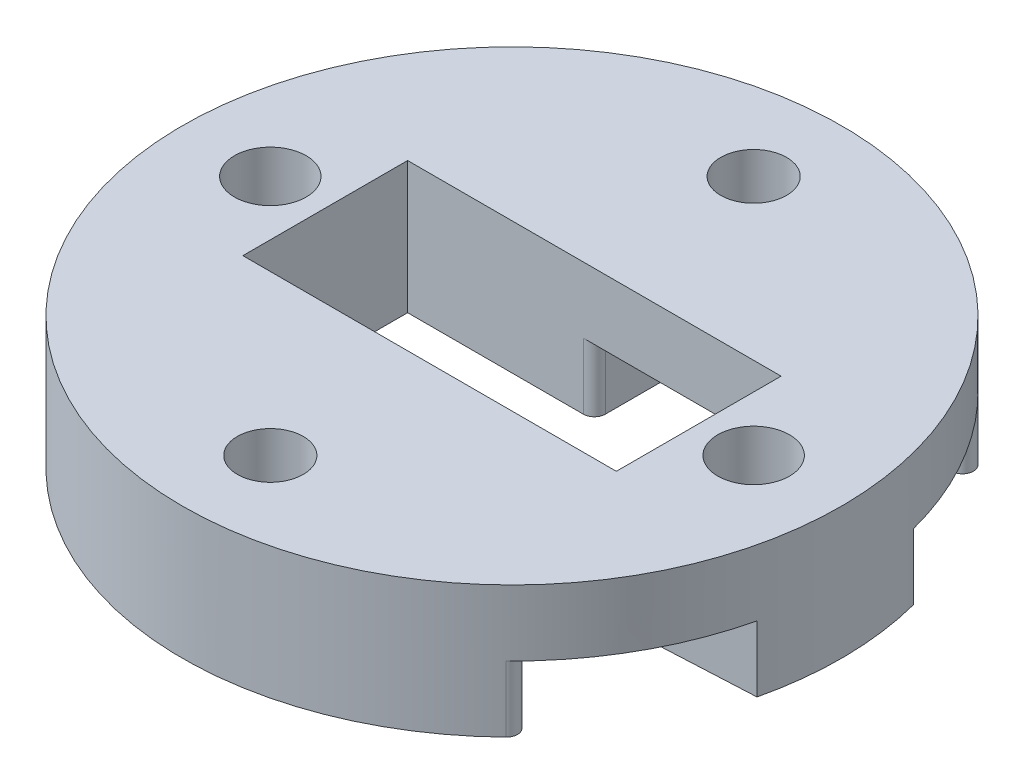
ISO-10303-21;
HEADER;
FILE_DESCRIPTION(('STEP AP214'),'2;1');
FILE_NAME('part.step','',(''),(''),'','','');
FILE_SCHEMA(('AUTOMOTIVE_DESIGN { 1 0 10303 214 1 1 1 1 }'));
ENDSEC;
DATA;
#1=APPLICATION_CONTEXT('core data for automotive mechanical design processes');
#2=APPLICATION_PROTOCOL_DEFINITION('international standard','automotive_design',2000,#1);
#3=PRODUCT_CONTEXT('',#1,'mechanical');
#4=PRODUCT('Part','Part','',(#3));
#5=PRODUCT_RELATED_PRODUCT_CATEGORY('part','',(#4));
#6=PRODUCT_DEFINITION_FORMATION('','',#4);
#7=PRODUCT_DEFINITION_CONTEXT('part definition',#1,'design');
#8=PRODUCT_DEFINITION('design','',#6,#7);
#9=PRODUCT_DEFINITION_SHAPE('','',#8);
#10=(LENGTH_UNIT() NAMED_UNIT(*) SI_UNIT(.MILLI.,.METRE.));
#11=(NAMED_UNIT(*) PLANE_ANGLE_UNIT() SI_UNIT($,.RADIAN.));
#12=(NAMED_UNIT(*) SI_UNIT($,.STERADIAN.) SOLID_ANGLE_UNIT());
#13=UNCERTAINTY_MEASURE_WITH_UNIT(LENGTH_MEASURE(1.E-05),#10,'distance_accuracy_value','');
#14=(GEOMETRIC_REPRESENTATION_CONTEXT(3) GLOBAL_UNCERTAINTY_ASSIGNED_CONTEXT((#13)) GLOBAL_UNIT_ASSIGNED_CONTEXT((#10,
#11,#12)) REPRESENTATION_CONTEXT('',''));
#15=CARTESIAN_POINT('',(0.,0.,0.));
#16=DIRECTION('',(0.,0.,1.));
#17=DIRECTION('',(1.,0.,0.));
#18=AXIS2_PLACEMENT_3D('',#15,#16,#17);
#19=CARTESIAN_POINT('',(0.,0.,0.));
#20=DIRECTION('',(0.,1.,0.));
#21=DIRECTION('',(0.,0.,1.));
#22=AXIS2_PLACEMENT_3D('',#19,#20,#21);
#23=PLANE('',#22);
#24=DIRECTION('',(1.,0.,0.));
#25=VECTOR('',#24,1.);
#26=CARTESIAN_POINT('',(0.,0.,-7.5));
#27=LINE('',#26,#25);
#28=CARTESIAN_POINT('',(17.,0.,-7.49999999999999));
#29=VERTEX_POINT('',#28);
#30=CARTESIAN_POINT('',(29.0473750965556,0.,-7.49999999999999));
#31=VERTEX_POINT('',#30);
#32=EDGE_CURVE('E427',#29,#31,#27,.T.);
#33=ORIENTED_EDGE('',*,*,#32,.F.);
#34=DIRECTION('',(-1.,0.,0.));
#35=VECTOR('',#34,1.);
#36=CARTESIAN_POINT('',(-17.,0.,-7.49999999999999));
#37=LINE('',#36,#35);
#38=CARTESIAN_POINT('',(-1.00000000000001,0.,-7.49999999999999));
#39=VERTEX_POINT('',#38);
#40=EDGE_CURVE('E379',#29,#39,#37,.T.);
#41=ORIENTED_EDGE('',*,*,#40,.T.);
#42=CARTESIAN_POINT('',(-1.,0.,-8.49999999999999));
#43=DIRECTION('',(0.,-1.,0.));
#44=DIRECTION('',(0.,0.,-1.));
#45=AXIS2_PLACEMENT_3D('',#42,#43,#44);
#46=CIRCLE('',#45,1.);
#47=CARTESIAN_POINT('',(0.,0.,-8.5));
#48=VERTEX_POINT('',#47);
#49=EDGE_CURVE('E269',#39,#48,#46,.F.);
#50=ORIENTED_EDGE('',*,*,#49,.T.);
#51=DIRECTION('',(0.,0.,1.));
#52=VECTOR('',#51,1.);
#53=CARTESIAN_POINT('',(0.,0.,0.));
#54=LINE('',#53,#52);
#55=CARTESIAN_POINT('',(0.,0.,-18.7566976916097));
#56=VERTEX_POINT('',#55);
#57=EDGE_CURVE('E282',#56,#48,#54,.T.);
#58=ORIENTED_EDGE('',*,*,#57,.F.);
#59=CARTESIAN_POINT('',(1.,0.,-18.7566976916097));
#60=DIRECTION('',(0.,-1.,0.));
#61=DIRECTION('',(0.,0.,-1.));
#62=AXIS2_PLACEMENT_3D('',#59,#60,#61);
#63=CIRCLE('',#62,1.);
#64=CARTESIAN_POINT('',(0.0300873514827654,0.,-19.0001508785806));
#65=VERTEX_POINT('',#64);
#66=EDGE_CURVE('E340',#56,#65,#63,.T.);
#67=ORIENTED_EDGE('',*,*,#66,.T.);
#68=CARTESIAN_POINT('',(0.,0.,-22.));
#69=DIRECTION('',(0.,1.,0.));
#70=DIRECTION('',(0.,0.,1.));
#71=AXIS2_PLACEMENT_3D('',#68,#69,#70);
#72=CIRCLE('',#71,3.);
#73=CARTESIAN_POINT('',(1.99188221367901,0.,-19.7566976916097));
#74=VERTEX_POINT('',#73);
#75=EDGE_CURVE('E400',#65,#74,#72,.T.);
#76=ORIENTED_EDGE('',*,*,#75,.T.);
#77=DIRECTION('',(-1.,0.,0.));
#78=VECTOR('',#77,1.);
#79=CARTESIAN_POINT('',(0.,0.,-19.7566976916097));
#80=LINE('',#79,#78);
#81=CARTESIAN_POINT('',(20.2523949432931,0.,-19.7566976916097));
#82=VERTEX_POINT('',#81);
#83=EDGE_CURVE('E338',#82,#74,#80,.T.);
#84=ORIENTED_EDGE('',*,*,#83,.F.);
#85=CARTESIAN_POINT('',(20.2523949432931,0.,-20.7566976916097));
#86=DIRECTION('',(0.,-1.,0.));
#87=DIRECTION('',(0.,0.,-1.));
#88=AXIS2_PLACEMENT_3D('',#85,#86,#87);
#89=CIRCLE('',#88,1.);
#90=CARTESIAN_POINT('',(20.9507533896136,0.,-21.4724458878721));
#91=VERTEX_POINT('',#90);
#92=EDGE_CURVE('E336',#91,#82,#89,.T.);
#93=ORIENTED_EDGE('',*,*,#92,.F.);
#94=CARTESIAN_POINT('',(0.,0.,0.));
#95=DIRECTION('',(0.,1.,0.));
#96=DIRECTION('',(0.,0.,1.));
#97=AXIS2_PLACEMENT_3D('',#94,#95,#96);
#98=CIRCLE('',#97,30.);
#99=EDGE_CURVE('E114',#31,#91,#98,.T.);
#100=ORIENTED_EDGE('',*,*,#99,.F.);
#101=EDGE_LOOP('',(#33,#41,#50,#58,#67,#76,#84,#93,#100));
#102=FACE_BOUND('',#101,.T.);
#103=ADVANCED_FACE('F99',(#102),#23,.F.);
#104=DIRECTION('',(-0.998754741045197,0.,0.0498895504062889));
#105=VECTOR('',#104,1.);
#106=CARTESIAN_POINT('',(0.416018130552311,0.,8.32839897064905));
#107=LINE('',#106,#105);
#108=CARTESIAN_POINT('',(29.1979169572441,0.,6.8906926616905));
#109=VERTEX_POINT('',#108);
#110=CARTESIAN_POINT('',(17.,0.,7.50000000000001));
#111=VERTEX_POINT('',#110);
#112=EDGE_CURVE('E122',#109,#111,#107,.T.);
#113=ORIENTED_EDGE('',*,*,#112,.F.);
#114=CARTESIAN_POINT('',(20.9507533896136,0.,21.4724458878721));
#115=VERTEX_POINT('',#114);
#116=EDGE_CURVE('E103',#115,#109,#98,.T.);
#117=ORIENTED_EDGE('',*,*,#116,.F.);
#118=CARTESIAN_POINT('',(20.2523949432931,0.,20.7566976916097));
#119=DIRECTION('',(0.,-1.,0.));
#120=DIRECTION('',(0.,0.,-1.));
#121=AXIS2_PLACEMENT_3D('',#118,#119,#120);
#122=CIRCLE('',#121,1.);
#123=CARTESIAN_POINT('',(20.2523949432931,0.,19.7566976916097));
#124=VERTEX_POINT('',#123);
#125=EDGE_CURVE('E333',#115,#124,#122,.F.);
#126=ORIENTED_EDGE('',*,*,#125,.T.);
#127=DIRECTION('',(1.,0.,0.));
#128=VECTOR('',#127,1.);
#129=CARTESIAN_POINT('',(0.,0.,19.7566976916097));
#130=LINE('',#129,#128);
#131=CARTESIAN_POINT('',(1.991882213679,0.,19.7566976916097));
#132=VERTEX_POINT('',#131);
#133=EDGE_CURVE('E330',#132,#124,#130,.T.);
#134=ORIENTED_EDGE('',*,*,#133,.F.);
#135=CARTESIAN_POINT('',(0.,0.,22.));
#136=DIRECTION('',(0.,1.,0.));
#137=DIRECTION('',(0.,0.,1.));
#138=AXIS2_PLACEMENT_3D('',#135,#136,#137);
#139=CIRCLE('',#138,3.);
#140=CARTESIAN_POINT('',(0.0300873514827662,0.,19.0001508785806));
#141=VERTEX_POINT('',#140);
#142=EDGE_CURVE('E396',#132,#141,#139,.T.);
#143=ORIENTED_EDGE('',*,*,#142,.T.);
#144=CARTESIAN_POINT('',(1.,0.,18.7566976916097));
#145=DIRECTION('',(0.,-1.,0.));
#146=DIRECTION('',(0.,0.,-1.));
#147=AXIS2_PLACEMENT_3D('',#144,#145,#146);
#148=CIRCLE('',#147,1.);
#149=CARTESIAN_POINT('',(0.,0.,18.7566976916097));
#150=VERTEX_POINT('',#149);
#151=EDGE_CURVE('E327',#141,#150,#148,.T.);
#152=ORIENTED_EDGE('',*,*,#151,.T.);
#153=DIRECTION('',(0.,0.,1.));
#154=VECTOR('',#153,1.);
#155=CARTESIAN_POINT('',(0.,0.,0.));
#156=LINE('',#155,#154);
#157=CARTESIAN_POINT('',(0.,0.,8.50000000000002));
#158=VERTEX_POINT('',#157);
#159=EDGE_CURVE('E324',#158,#150,#156,.T.);
#160=ORIENTED_EDGE('',*,*,#159,.F.);
#161=CARTESIAN_POINT('',(-1.,0.,8.50000000000001));
#162=DIRECTION('',(0.,-1.,0.));
#163=DIRECTION('',(0.,0.,-1.));
#164=AXIS2_PLACEMENT_3D('',#161,#162,#163);
#165=CIRCLE('',#164,1.);
#166=CARTESIAN_POINT('',(-1.,0.,7.50000000000001));
#167=VERTEX_POINT('',#166);
#168=EDGE_CURVE('E272',#158,#167,#165,.F.);
#169=ORIENTED_EDGE('',*,*,#168,.T.);
#170=DIRECTION('',(1.,0.,0.));
#171=VECTOR('',#170,1.);
#172=CARTESIAN_POINT('',(-17.,0.,7.50000000000001));
#173=LINE('',#172,#171);
#174=EDGE_CURVE('E375',#167,#111,#173,.T.);
#175=ORIENTED_EDGE('',*,*,#174,.T.);
#176=EDGE_LOOP('',(#113,#117,#126,#134,#143,#152,#160,#169,#175));
#177=FACE_BOUND('',#176,.T.);
#178=ADVANCED_FACE('F450',(#177),#23,.F.);
#179=CARTESIAN_POINT('',(0.,6.,0.));
#180=DIRECTION('',(0.,1.,0.));
#181=DIRECTION('',(0.,0.,1.));
#182=AXIS2_PLACEMENT_3D('',#179,#180,#181);
#183=PLANE('',#182);
#184=CARTESIAN_POINT('',(0.,6.,-22.));
#185=DIRECTION('',(0.,1.,0.));
#186=DIRECTION('',(0.,0.,1.));
#187=AXIS2_PLACEMENT_3D('',#184,#185,#186);
#188=CIRCLE('',#187,3.);
#189=CARTESIAN_POINT('',(0.,6.,-19.));
#190=VERTEX_POINT('',#189);
#191=EDGE_CURVE('E403',#190,#190,#188,.T.);
#192=ORIENTED_EDGE('',*,*,#191,.F.);
#193=EDGE_LOOP('',(#192));
#194=FACE_BOUND('',#193,.T.);
#195=CARTESIAN_POINT('',(-22.,6.,0.));
#196=DIRECTION('',(0.,1.,0.));
#197=DIRECTION('',(0.,0.,1.));
#198=AXIS2_PLACEMENT_3D('',#195,#196,#197);
#199=CIRCLE('',#198,3.26527405947026);
#200=CARTESIAN_POINT('',(-22.,6.,3.26527405947027));
#201=VERTEX_POINT('',#200);
#202=EDGE_CURVE('E411',#201,#201,#199,.T.);
#203=ORIENTED_EDGE('',*,*,#202,.F.);
#204=EDGE_LOOP('',(#203));
#205=FACE_BOUND('',#204,.T.);
#206=CARTESIAN_POINT('',(0.,6.,0.));
#207=DIRECTION('',(0.,1.,0.));
#208=DIRECTION('',(0.,0.,1.));
#209=AXIS2_PLACEMENT_3D('',#206,#207,#208);
#210=CIRCLE('',#209,30.);
#211=CARTESIAN_POINT('',(0.,6.,30.));
#212=VERTEX_POINT('',#211);
#213=EDGE_CURVE('E12',#212,#212,#210,.T.);
#214=ORIENTED_EDGE('',*,*,#213,.T.);
#215=EDGE_LOOP('',(#214));
#216=FACE_BOUND('',#215,.T.);
#217=CARTESIAN_POINT('',(22.,6.,0.));
#218=DIRECTION('',(0.,1.,0.));
#219=DIRECTION('',(0.,0.,1.));
#220=AXIS2_PLACEMENT_3D('',#217,#218,#219);
#221=CIRCLE('',#220,3.26527405947026);
#222=CARTESIAN_POINT('',(22.,6.,3.26527405947026));
#223=VERTEX_POINT('',#222);
#224=EDGE_CURVE('E406',#223,#223,#221,.T.);
#225=ORIENTED_EDGE('',*,*,#224,.F.);
#226=EDGE_LOOP('',(#225));
#227=FACE_BOUND('',#226,.T.);
#228=CARTESIAN_POINT('',(0.,6.,22.));
#229=DIRECTION('',(0.,1.,0.));
#230=DIRECTION('',(0.,0.,1.));
#231=AXIS2_PLACEMENT_3D('',#228,#229,#230);
#232=CIRCLE('',#231,3.);
#233=CARTESIAN_POINT('',(0.,6.,25.));
#234=VERTEX_POINT('',#233);
#235=EDGE_CURVE('E397',#234,#234,#232,.T.);
#236=ORIENTED_EDGE('',*,*,#235,.F.);
#237=EDGE_LOOP('',(#236));
#238=FACE_BOUND('',#237,.T.);
#239=DIRECTION('',(1.,0.,0.));
#240=VECTOR('',#239,1.);
#241=CARTESIAN_POINT('',(-17.,6.,7.50000000000001));
#242=LINE('',#241,#240);
#243=CARTESIAN_POINT('',(-17.,6.,7.50000000000001));
#244=VERTEX_POINT('',#243);
#245=CARTESIAN_POINT('',(17.,6.,7.50000000000001));
#246=VERTEX_POINT('',#245);
#247=EDGE_CURVE('E378',#244,#246,#242,.T.);
#248=ORIENTED_EDGE('',*,*,#247,.F.);
#249=DIRECTION('',(0.,0.,1.));
#250=VECTOR('',#249,1.);
#251=CARTESIAN_POINT('',(-17.,6.,-7.49999999999999));
#252=LINE('',#251,#250);
#253=CARTESIAN_POINT('',(-17.,6.,-7.49999999999999));
#254=VERTEX_POINT('',#253);
#255=EDGE_CURVE('E376',#254,#244,#252,.T.);
#256=ORIENTED_EDGE('',*,*,#255,.F.);
#257=DIRECTION('',(-1.,0.,0.));
#258=VECTOR('',#257,1.);
#259=CARTESIAN_POINT('',(-17.,6.,-7.49999999999999));
#260=LINE('',#259,#258);
#261=CARTESIAN_POINT('',(17.,6.,-7.49999999999999));
#262=VERTEX_POINT('',#261);
#263=EDGE_CURVE('E383',#262,#254,#260,.T.);
#264=ORIENTED_EDGE('',*,*,#263,.F.);
#265=DIRECTION('',(0.,0.,-1.));
#266=VECTOR('',#265,1.);
#267=CARTESIAN_POINT('',(17.,6.,-7.49999999999999));
#268=LINE('',#267,#266);
#269=EDGE_CURVE('E381',#246,#262,#268,.T.);
#270=ORIENTED_EDGE('',*,*,#269,.F.);
#271=EDGE_LOOP('',(#248,#256,#264,#270));
#272=FACE_BOUND('',#271,.T.);
#273=ADVANCED_FACE('F454',(#194,#205,#216,#227,#238,#272),#183,.T.);
#274=CARTESIAN_POINT('',(0.,6.,0.));
#275=DIRECTION('',(0.,-1.,0.));
#276=DIRECTION('',(0.,0.,-1.));
#277=AXIS2_PLACEMENT_3D('',#274,#275,#276);
#278=CYLINDRICAL_SURFACE('',#277,30.);
#279=ORIENTED_EDGE('',*,*,#213,.F.);
#280=EDGE_LOOP('',(#279));
#281=FACE_BOUND('',#280,.T.);
#282=ORIENTED_EDGE('',*,*,#116,.T.);
#283=DIRECTION('',(0.,1.,0.));
#284=VECTOR('',#283,1.);
#285=CARTESIAN_POINT('',(29.1979169572441,-6.,6.8906926616905));
#286=LINE('',#285,#284);
#287=CARTESIAN_POINT('',(29.1979169572441,-6.,6.8906926616905));
#288=VERTEX_POINT('',#287);
#289=EDGE_CURVE('E274',#288,#109,#286,.T.);
#290=ORIENTED_EDGE('',*,*,#289,.F.);
#291=CARTESIAN_POINT('',(0.,-6.,0.));
#292=DIRECTION('',(0.,-1.,0.));
#293=DIRECTION('',(0.,0.,-1.));
#294=AXIS2_PLACEMENT_3D('',#291,#292,#293);
#295=CIRCLE('',#294,30.);
#296=CARTESIAN_POINT('',(29.0473750965556,-6.,-7.49999999999999));
#297=VERTEX_POINT('',#296);
#298=EDGE_CURVE('E253',#297,#288,#295,.T.);
#299=ORIENTED_EDGE('',*,*,#298,.F.);
#300=DIRECTION('',(0.,1.,0.));
#301=VECTOR('',#300,1.);
#302=CARTESIAN_POINT('',(29.0473750965556,-6.,-7.49999999999999));
#303=LINE('',#302,#301);
#304=EDGE_CURVE('E250',#297,#31,#303,.T.);
#305=ORIENTED_EDGE('',*,*,#304,.T.);
#306=ORIENTED_EDGE('',*,*,#99,.T.);
#307=DIRECTION('',(0.,1.,0.));
#308=VECTOR('',#307,1.);
#309=CARTESIAN_POINT('',(20.9507533896136,-6.,-21.4724458878721));
#310=LINE('',#309,#308);
#311=CARTESIAN_POINT('',(20.9507533896136,-6.,-21.4724458878721));
#312=VERTEX_POINT('',#311);
#313=EDGE_CURVE('E356',#312,#91,#310,.T.);
#314=ORIENTED_EDGE('',*,*,#313,.F.);
#315=CARTESIAN_POINT('',(0.,-6.,0.));
#316=DIRECTION('',(0.,-1.,0.));
#317=DIRECTION('',(0.,0.,-1.));
#318=AXIS2_PLACEMENT_3D('',#315,#316,#317);
#319=CIRCLE('',#318,30.);
#320=CARTESIAN_POINT('',(20.9507533896136,-6.,21.4724458878721));
#321=VERTEX_POINT('',#320);
#322=EDGE_CURVE('E305',#321,#312,#319,.T.);
#323=ORIENTED_EDGE('',*,*,#322,.F.);
#324=DIRECTION('',(0.,1.,0.));
#325=VECTOR('',#324,1.);
#326=CARTESIAN_POINT('',(20.9507533896136,-6.,21.4724458878721));
#327=LINE('',#326,#325);
#328=EDGE_CURVE('E359',#321,#115,#327,.T.);
#329=ORIENTED_EDGE('',*,*,#328,.T.);
#330=EDGE_LOOP('',(#282,#290,#299,#305,#306,#314,#323,#329));
#331=FACE_BOUND('',#330,.T.);
#332=ADVANCED_FACE('F101',(#281,#331),#278,.T.);
#333=CARTESIAN_POINT('',(-22.,6.,0.));
#334=DIRECTION('',(0.,-1.,0.));
#335=DIRECTION('',(0.,0.,-1.));
#336=AXIS2_PLACEMENT_3D('',#333,#334,#335);
#337=CYLINDRICAL_SURFACE('',#336,3.26527405947026);
#338=ORIENTED_EDGE('',*,*,#202,.T.);
#339=EDGE_LOOP('',(#338));
#340=FACE_BOUND('',#339,.T.);
#341=CARTESIAN_POINT('',(-22.,-6.,0.));
#342=DIRECTION('',(0.,-1.,0.));
#343=DIRECTION('',(0.,0.,-1.));
#344=AXIS2_PLACEMENT_3D('',#341,#342,#343);
#345=CIRCLE('',#344,3.26527405947026);
#346=CARTESIAN_POINT('',(-22.,-6.,-3.26527405947025));
#347=VERTEX_POINT('',#346);
#348=EDGE_CURVE('E318',#347,#347,#345,.F.);
#349=ORIENTED_EDGE('',*,*,#348,.F.);
#350=EDGE_LOOP('',(#349));
#351=FACE_BOUND('',#350,.T.);
#352=ADVANCED_FACE('F438',(#340,#351),#337,.F.);
#353=CARTESIAN_POINT('',(22.,6.,0.));
#354=DIRECTION('',(0.,-1.,0.));
#355=DIRECTION('',(0.,0.,-1.));
#356=AXIS2_PLACEMENT_3D('',#353,#354,#355);
#357=CYLINDRICAL_SURFACE('',#356,3.26527405947026);
#358=ORIENTED_EDGE('',*,*,#224,.T.);
#359=EDGE_LOOP('',(#358));
#360=FACE_BOUND('',#359,.T.);
#361=CARTESIAN_POINT('',(22.,-6.,0.));
#362=DIRECTION('',(0.,-1.,0.));
#363=DIRECTION('',(0.,0.,-1.));
#364=AXIS2_PLACEMENT_3D('',#361,#362,#363);
#365=CIRCLE('',#364,3.26527405947026);
#366=CARTESIAN_POINT('',(22.,-6.,-3.26527405947025));
#367=VERTEX_POINT('',#366);
#368=EDGE_CURVE('E263',#367,#367,#365,.F.);
#369=ORIENTED_EDGE('',*,*,#368,.F.);
#370=EDGE_LOOP('',(#369));
#371=FACE_BOUND('',#370,.T.);
#372=ADVANCED_FACE('F435',(#360,#371),#357,.F.);
#373=CARTESIAN_POINT('',(0.,6.,-22.));
#374=DIRECTION('',(0.,-1.,0.));
#375=DIRECTION('',(0.,0.,-1.));
#376=AXIS2_PLACEMENT_3D('',#373,#374,#375);
#377=CYLINDRICAL_SURFACE('',#376,3.);
#378=ORIENTED_EDGE('',*,*,#191,.T.);
#379=EDGE_LOOP('',(#378));
#380=FACE_BOUND('',#379,.T.);
#381=ORIENTED_EDGE('',*,*,#75,.F.);
#382=DIRECTION('',(0.,1.,0.));
#383=VECTOR('',#382,1.);
#384=CARTESIAN_POINT('',(0.0300873514827654,-6.,-19.0001508785806));
#385=LINE('',#384,#383);
#386=CARTESIAN_POINT('',(0.0300873514827654,-6.,-19.0001508785806));
#387=VERTEX_POINT('',#386);
#388=EDGE_CURVE('E348',#387,#65,#385,.T.);
#389=ORIENTED_EDGE('',*,*,#388,.F.);
#390=CARTESIAN_POINT('',(0.,-6.,-22.));
#391=DIRECTION('',(0.,-1.,0.));
#392=DIRECTION('',(0.,0.,-1.));
#393=AXIS2_PLACEMENT_3D('',#390,#391,#392);
#394=CIRCLE('',#393,3.);
#395=CARTESIAN_POINT('',(1.99188221367901,-6.,-19.7566976916097));
#396=VERTEX_POINT('',#395);
#397=EDGE_CURVE('E311',#396,#387,#394,.F.);
#398=ORIENTED_EDGE('',*,*,#397,.F.);
#399=DIRECTION('',(0.,1.,0.));
#400=VECTOR('',#399,1.);
#401=CARTESIAN_POINT('',(1.99188221367901,-6.,-19.7566976916097));
#402=LINE('',#401,#400);
#403=EDGE_CURVE('E350',#396,#74,#402,.T.);
#404=ORIENTED_EDGE('',*,*,#403,.T.);
#405=EDGE_LOOP('',(#381,#389,#398,#404));
#406=FACE_BOUND('',#405,.T.);
#407=ADVANCED_FACE('F437',(#380,#406),#377,.F.);
#408=CARTESIAN_POINT('',(0.,6.,22.));
#409=DIRECTION('',(0.,-1.,0.));
#410=DIRECTION('',(0.,0.,-1.));
#411=AXIS2_PLACEMENT_3D('',#408,#409,#410);
#412=CYLINDRICAL_SURFACE('',#411,3.);
#413=ORIENTED_EDGE('',*,*,#235,.T.);
#414=EDGE_LOOP('',(#413));
#415=FACE_BOUND('',#414,.T.);
#416=ORIENTED_EDGE('',*,*,#142,.F.);
#417=DIRECTION('',(0.,1.,0.));
#418=VECTOR('',#417,1.);
#419=CARTESIAN_POINT('',(1.991882213679,-6.,19.7566976916097));
#420=LINE('',#419,#418);
#421=CARTESIAN_POINT('',(1.991882213679,-6.,19.7566976916097));
#422=VERTEX_POINT('',#421);
#423=EDGE_CURVE('E363',#422,#132,#420,.T.);
#424=ORIENTED_EDGE('',*,*,#423,.F.);
#425=CARTESIAN_POINT('',(0.,-6.,22.));
#426=DIRECTION('',(0.,-1.,0.));
#427=DIRECTION('',(0.,0.,-1.));
#428=AXIS2_PLACEMENT_3D('',#425,#426,#427);
#429=CIRCLE('',#428,3.);
#430=CARTESIAN_POINT('',(0.0300873514827662,-6.,19.0001508785806));
#431=VERTEX_POINT('',#430);
#432=EDGE_CURVE('E298',#431,#422,#429,.F.);
#433=ORIENTED_EDGE('',*,*,#432,.F.);
#434=DIRECTION('',(0.,1.,0.));
#435=VECTOR('',#434,1.);
#436=CARTESIAN_POINT('',(0.0300873514827662,-6.,19.0001508785806));
#437=LINE('',#436,#435);
#438=EDGE_CURVE('E365',#431,#141,#437,.T.);
#439=ORIENTED_EDGE('',*,*,#438,.T.);
#440=EDGE_LOOP('',(#416,#424,#433,#439));
#441=FACE_BOUND('',#440,.T.);
#442=ADVANCED_FACE('F445',(#415,#441),#412,.F.);
#443=CARTESIAN_POINT('',(-17.,6.,-7.49999999999999));
#444=DIRECTION('',(1.,0.,0.));
#445=DIRECTION('',(0.,0.,-1.));
#446=AXIS2_PLACEMENT_3D('',#443,#444,#445);
#447=PLANE('',#446);
#448=DIRECTION('',(0.,-1.,0.));
#449=VECTOR('',#448,1.);
#450=CARTESIAN_POINT('',(-17.,6.,7.50000000000001));
#451=LINE('',#450,#449);
#452=CARTESIAN_POINT('',(-17.,-6.,7.50000000000001));
#453=VERTEX_POINT('',#452);
#454=EDGE_CURVE('E394',#244,#453,#451,.T.);
#455=ORIENTED_EDGE('',*,*,#454,.T.);
#456=DIRECTION('',(0.,0.,1.));
#457=VECTOR('',#456,1.);
#458=CARTESIAN_POINT('',(-17.,-6.,0.));
#459=LINE('',#458,#457);
#460=CARTESIAN_POINT('',(-17.,-6.,-7.49999999999999));
#461=VERTEX_POINT('',#460);
#462=EDGE_CURVE('E285',#461,#453,#459,.T.);
#463=ORIENTED_EDGE('',*,*,#462,.F.);
#464=DIRECTION('',(0.,-1.,0.));
#465=VECTOR('',#464,1.);
#466=CARTESIAN_POINT('',(-17.,6.,-7.49999999999999));
#467=LINE('',#466,#465);
#468=EDGE_CURVE('E385',#254,#461,#467,.T.);
#469=ORIENTED_EDGE('',*,*,#468,.F.);
#470=ORIENTED_EDGE('',*,*,#255,.T.);
#471=EDGE_LOOP('',(#455,#463,#469,#470));
#472=FACE_BOUND('',#471,.T.);
#473=ADVANCED_FACE('F487',(#472),#447,.T.);
#474=CARTESIAN_POINT('',(-17.,6.,7.50000000000001));
#475=DIRECTION('',(0.,0.,-1.));
#476=DIRECTION('',(-1.,0.,0.));
#477=AXIS2_PLACEMENT_3D('',#474,#475,#476);
#478=PLANE('',#477);
#479=ORIENTED_EDGE('',*,*,#174,.F.);
#480=DIRECTION('',(0.,1.,0.));
#481=VECTOR('',#480,1.);
#482=CARTESIAN_POINT('',(-1.00000000000001,-6.,7.50000000000001));
#483=LINE('',#482,#481);
#484=CARTESIAN_POINT('',(-1.00000000000001,-6.,7.50000000000001));
#485=VERTEX_POINT('',#484);
#486=EDGE_CURVE('E371',#485,#167,#483,.T.);
#487=ORIENTED_EDGE('',*,*,#486,.F.);
#488=DIRECTION('',(1.,0.,0.));
#489=VECTOR('',#488,1.);
#490=CARTESIAN_POINT('',(0.,-6.,7.50000000000001));
#491=LINE('',#490,#489);
#492=EDGE_CURVE('E288',#453,#485,#491,.T.);
#493=ORIENTED_EDGE('',*,*,#492,.F.);
#494=ORIENTED_EDGE('',*,*,#454,.F.);
#495=ORIENTED_EDGE('',*,*,#247,.T.);
#496=DIRECTION('',(0.,-1.,0.));
#497=VECTOR('',#496,1.);
#498=CARTESIAN_POINT('',(17.,6.,7.50000000000001));
#499=LINE('',#498,#497);
#500=EDGE_CURVE('E391',#246,#111,#499,.T.);
#501=ORIENTED_EDGE('',*,*,#500,.T.);
#502=EDGE_LOOP('',(#479,#487,#493,#494,#495,#501));
#503=FACE_BOUND('',#502,.T.);
#504=ADVANCED_FACE('F479',(#503),#478,.T.);
#505=CARTESIAN_POINT('',(17.,6.,-7.49999999999999));
#506=DIRECTION('',(-1.,0.,0.));
#507=DIRECTION('',(0.,0.,1.));
#508=AXIS2_PLACEMENT_3D('',#505,#506,#507);
#509=PLANE('',#508);
#510=DIRECTION('',(0.,-1.,0.));
#511=VECTOR('',#510,1.);
#512=CARTESIAN_POINT('',(17.,6.,-7.49999999999999));
#513=LINE('',#512,#511);
#514=EDGE_CURVE('E268',#262,#29,#513,.T.);
#515=ORIENTED_EDGE('',*,*,#514,.T.);
#516=DIRECTION('',(0.,1.,0.));
#517=VECTOR('',#516,1.);
#518=CARTESIAN_POINT('',(17.,-6.,-7.49999999999999));
#519=LINE('',#518,#517);
#520=CARTESIAN_POINT('',(17.,-6.,-7.49999999999999));
#521=VERTEX_POINT('',#520);
#522=EDGE_CURVE('E248',#521,#29,#519,.T.);
#523=ORIENTED_EDGE('',*,*,#522,.F.);
#524=DIRECTION('',(0.,0.,-1.));
#525=VECTOR('',#524,1.);
#526=CARTESIAN_POINT('',(17.,-6.,0.));
#527=LINE('',#526,#525);
#528=CARTESIAN_POINT('',(17.,-6.,7.50000000000001));
#529=VERTEX_POINT('',#528);
#530=EDGE_CURVE('E254',#529,#521,#527,.T.);
#531=ORIENTED_EDGE('',*,*,#530,.F.);
#532=DIRECTION('',(0.,1.,0.));
#533=VECTOR('',#532,1.);
#534=CARTESIAN_POINT('',(17.,-6.,7.50000000000001));
#535=LINE('',#534,#533);
#536=EDGE_CURVE('E423',#529,#111,#535,.T.);
#537=ORIENTED_EDGE('',*,*,#536,.T.);
#538=ORIENTED_EDGE('',*,*,#500,.F.);
#539=ORIENTED_EDGE('',*,*,#269,.T.);
#540=EDGE_LOOP('',(#515,#523,#531,#537,#538,#539));
#541=FACE_BOUND('',#540,.T.);
#542=ADVANCED_FACE('F266',(#541),#509,.T.);
#543=CARTESIAN_POINT('',(-17.,6.,-7.49999999999999));
#544=DIRECTION('',(0.,0.,1.));
#545=DIRECTION('',(1.,0.,0.));
#546=AXIS2_PLACEMENT_3D('',#543,#544,#545);
#547=PLANE('',#546);
#548=ORIENTED_EDGE('',*,*,#40,.F.);
#549=ORIENTED_EDGE('',*,*,#514,.F.);
#550=ORIENTED_EDGE('',*,*,#263,.T.);
#551=ORIENTED_EDGE('',*,*,#468,.T.);
#552=DIRECTION('',(-1.,0.,0.));
#553=VECTOR('',#552,1.);
#554=CARTESIAN_POINT('',(0.,-6.,-7.49999999999999));
#555=LINE('',#554,#553);
#556=CARTESIAN_POINT('',(-1.00000000000001,-6.,-7.49999999999999));
#557=VERTEX_POINT('',#556);
#558=EDGE_CURVE('E281',#557,#461,#555,.T.);
#559=ORIENTED_EDGE('',*,*,#558,.F.);
#560=DIRECTION('',(0.,1.,0.));
#561=VECTOR('',#560,1.);
#562=CARTESIAN_POINT('',(-1.00000000000001,-6.,-7.49999999999999));
#563=LINE('',#562,#561);
#564=EDGE_CURVE('E373',#557,#39,#563,.T.);
#565=ORIENTED_EDGE('',*,*,#564,.T.);
#566=EDGE_LOOP('',(#548,#549,#550,#551,#559,#565));
#567=FACE_BOUND('',#566,.T.);
#568=ADVANCED_FACE('F483',(#567),#547,.T.);
#569=CARTESIAN_POINT('',(-1.,-6.,-8.49999999999999));
#570=DIRECTION('',(0.,1.,0.));
#571=DIRECTION('',(0.,0.,1.));
#572=AXIS2_PLACEMENT_3D('',#569,#570,#571);
#573=CYLINDRICAL_SURFACE('',#572,1.);
#574=ORIENTED_EDGE('',*,*,#49,.F.);
#575=ORIENTED_EDGE('',*,*,#564,.F.);
#576=CARTESIAN_POINT('',(-1.,-6.,-8.49999999999999));
#577=DIRECTION('',(0.,-1.,0.));
#578=DIRECTION('',(0.,0.,-1.));
#579=AXIS2_PLACEMENT_3D('',#576,#577,#578);
#580=CIRCLE('',#579,1.);
#581=CARTESIAN_POINT('',(0.,-6.,-8.5));
#582=VERTEX_POINT('',#581);
#583=EDGE_CURVE('E278',#557,#582,#580,.F.);
#584=ORIENTED_EDGE('',*,*,#583,.T.);
#585=DIRECTION('',(0.,1.,0.));
#586=VECTOR('',#585,1.);
#587=CARTESIAN_POINT('',(0.,-6.,-8.5));
#588=LINE('',#587,#586);
#589=EDGE_CURVE('E320',#582,#48,#588,.T.);
#590=ORIENTED_EDGE('',*,*,#589,.T.);
#591=EDGE_LOOP('',(#574,#575,#584,#590));
#592=FACE_BOUND('',#591,.T.);
#593=ADVANCED_FACE('F542',(#592),#573,.T.);
#594=CARTESIAN_POINT('',(-1.,-6.,8.50000000000001));
#595=DIRECTION('',(0.,1.,0.));
#596=DIRECTION('',(0.,0.,1.));
#597=AXIS2_PLACEMENT_3D('',#594,#595,#596);
#598=CYLINDRICAL_SURFACE('',#597,1.);
#599=ORIENTED_EDGE('',*,*,#168,.F.);
#600=DIRECTION('',(0.,1.,0.));
#601=VECTOR('',#600,1.);
#602=CARTESIAN_POINT('',(0.,-6.,8.50000000000002));
#603=LINE('',#602,#601);
#604=CARTESIAN_POINT('',(0.,-6.,8.50000000000002));
#605=VERTEX_POINT('',#604);
#606=EDGE_CURVE('E369',#605,#158,#603,.T.);
#607=ORIENTED_EDGE('',*,*,#606,.F.);
#608=CARTESIAN_POINT('',(-1.,-6.,8.50000000000001));
#609=DIRECTION('',(0.,-1.,0.));
#610=DIRECTION('',(0.,0.,-1.));
#611=AXIS2_PLACEMENT_3D('',#608,#609,#610);
#612=CIRCLE('',#611,1.);
#613=EDGE_CURVE('E290',#605,#485,#612,.F.);
#614=ORIENTED_EDGE('',*,*,#613,.T.);
#615=ORIENTED_EDGE('',*,*,#486,.T.);
#616=EDGE_LOOP('',(#599,#607,#614,#615));
#617=FACE_BOUND('',#616,.T.);
#618=ADVANCED_FACE('F496',(#617),#598,.T.);
#619=CARTESIAN_POINT('',(0.,-6.,0.));
#620=DIRECTION('',(-1.,0.,0.));
#621=DIRECTION('',(0.,0.,1.));
#622=AXIS2_PLACEMENT_3D('',#619,#620,#621);
#623=PLANE('',#622);
#624=ORIENTED_EDGE('',*,*,#159,.T.);
#625=DIRECTION('',(0.,1.,0.));
#626=VECTOR('',#625,1.);
#627=CARTESIAN_POINT('',(0.,-6.,18.7566976916097));
#628=LINE('',#627,#626);
#629=CARTESIAN_POINT('',(0.,-6.,18.7566976916097));
#630=VERTEX_POINT('',#629);
#631=EDGE_CURVE('E367',#630,#150,#628,.T.);
#632=ORIENTED_EDGE('',*,*,#631,.F.);
#633=DIRECTION('',(0.,0.,1.));
#634=VECTOR('',#633,1.);
#635=CARTESIAN_POINT('',(0.,-6.,0.));
#636=LINE('',#635,#634);
#637=EDGE_CURVE('E293',#605,#630,#636,.T.);
#638=ORIENTED_EDGE('',*,*,#637,.F.);
#639=ORIENTED_EDGE('',*,*,#606,.T.);
#640=EDGE_LOOP('',(#624,#632,#638,#639));
#641=FACE_BOUND('',#640,.T.);
#642=ADVANCED_FACE('F501',(#641),#623,.F.);
#643=CARTESIAN_POINT('',(1.,-6.,18.7566976916097));
#644=DIRECTION('',(0.,1.,0.));
#645=DIRECTION('',(0.,0.,1.));
#646=AXIS2_PLACEMENT_3D('',#643,#644,#645);
#647=CYLINDRICAL_SURFACE('',#646,1.);
#648=ORIENTED_EDGE('',*,*,#151,.F.);
#649=ORIENTED_EDGE('',*,*,#438,.F.);
#650=CARTESIAN_POINT('',(1.,-6.,18.7566976916097));
#651=DIRECTION('',(0.,-1.,0.));
#652=DIRECTION('',(0.,0.,-1.));
#653=AXIS2_PLACEMENT_3D('',#650,#651,#652);
#654=CIRCLE('',#653,1.);
#655=EDGE_CURVE('E295',#431,#630,#654,.T.);
#656=ORIENTED_EDGE('',*,*,#655,.T.);
#657=ORIENTED_EDGE('',*,*,#631,.T.);
#658=EDGE_LOOP('',(#648,#649,#656,#657));
#659=FACE_BOUND('',#658,.T.);
#660=ADVANCED_FACE('F505',(#659),#647,.F.);
#661=CARTESIAN_POINT('',(0.,-6.,19.7566976916097));
#662=DIRECTION('',(0.,0.,1.));
#663=DIRECTION('',(1.,0.,0.));
#664=AXIS2_PLACEMENT_3D('',#661,#662,#663);
#665=PLANE('',#664);
#666=ORIENTED_EDGE('',*,*,#133,.T.);
#667=DIRECTION('',(0.,1.,0.));
#668=VECTOR('',#667,1.);
#669=CARTESIAN_POINT('',(20.2523949432931,-6.,19.7566976916097));
#670=LINE('',#669,#668);
#671=CARTESIAN_POINT('',(20.2523949432931,-6.,19.7566976916097));
#672=VERTEX_POINT('',#671);
#673=EDGE_CURVE('E361',#672,#124,#670,.T.);
#674=ORIENTED_EDGE('',*,*,#673,.F.);
#675=DIRECTION('',(1.,0.,0.));
#676=VECTOR('',#675,1.);
#677=CARTESIAN_POINT('',(0.,-6.,19.7566976916097));
#678=LINE('',#677,#676);
#679=EDGE_CURVE('E300',#422,#672,#678,.T.);
#680=ORIENTED_EDGE('',*,*,#679,.F.);
#681=ORIENTED_EDGE('',*,*,#423,.T.);
#682=EDGE_LOOP('',(#666,#674,#680,#681));
#683=FACE_BOUND('',#682,.T.);
#684=ADVANCED_FACE('F514',(#683),#665,.F.);
#685=CARTESIAN_POINT('',(20.2523949432931,-6.,20.7566976916097));
#686=DIRECTION('',(0.,1.,0.));
#687=DIRECTION('',(0.,0.,1.));
#688=AXIS2_PLACEMENT_3D('',#685,#686,#687);
#689=CYLINDRICAL_SURFACE('',#688,1.);
#690=ORIENTED_EDGE('',*,*,#125,.F.);
#691=ORIENTED_EDGE('',*,*,#328,.F.);
#692=CARTESIAN_POINT('',(20.2523949432931,-6.,20.7566976916097));
#693=DIRECTION('',(0.,-1.,0.));
#694=DIRECTION('',(0.,0.,-1.));
#695=AXIS2_PLACEMENT_3D('',#692,#693,#694);
#696=CIRCLE('',#695,1.);
#697=EDGE_CURVE('E302',#321,#672,#696,.F.);
#698=ORIENTED_EDGE('',*,*,#697,.T.);
#699=ORIENTED_EDGE('',*,*,#673,.T.);
#700=EDGE_LOOP('',(#690,#691,#698,#699));
#701=FACE_BOUND('',#700,.T.);
#702=ADVANCED_FACE('F517',(#701),#689,.T.);
#703=CARTESIAN_POINT('',(20.2523949432931,-6.,-20.7566976916097));
#704=DIRECTION('',(0.,1.,0.));
#705=DIRECTION('',(0.,0.,1.));
#706=AXIS2_PLACEMENT_3D('',#703,#704,#705);
#707=CYLINDRICAL_SURFACE('',#706,1.);
#708=ORIENTED_EDGE('',*,*,#92,.T.);
#709=DIRECTION('',(0.,1.,0.));
#710=VECTOR('',#709,1.);
#711=CARTESIAN_POINT('',(20.2523949432931,-6.,-19.7566976916097));
#712=LINE('',#711,#710);
#713=CARTESIAN_POINT('',(20.2523949432931,-6.,-19.7566976916097));
#714=VERTEX_POINT('',#713);
#715=EDGE_CURVE('E353',#714,#82,#712,.T.);
#716=ORIENTED_EDGE('',*,*,#715,.F.);
#717=CARTESIAN_POINT('',(20.2523949432931,-6.,-20.7566976916097));
#718=DIRECTION('',(0.,-1.,0.));
#719=DIRECTION('',(0.,0.,-1.));
#720=AXIS2_PLACEMENT_3D('',#717,#718,#719);
#721=CIRCLE('',#720,1.);
#722=EDGE_CURVE('E307',#312,#714,#721,.T.);
#723=ORIENTED_EDGE('',*,*,#722,.F.);
#724=ORIENTED_EDGE('',*,*,#313,.T.);
#725=EDGE_LOOP('',(#708,#716,#723,#724));
#726=FACE_BOUND('',#725,.T.);
#727=ADVANCED_FACE('F523',(#726),#707,.T.);
#728=CARTESIAN_POINT('',(0.,-6.,-19.7566976916097));
#729=DIRECTION('',(0.,0.,-1.));
#730=DIRECTION('',(-1.,0.,0.));
#731=AXIS2_PLACEMENT_3D('',#728,#729,#730);
#732=PLANE('',#731);
#733=ORIENTED_EDGE('',*,*,#83,.T.);
#734=ORIENTED_EDGE('',*,*,#403,.F.);
#735=DIRECTION('',(-1.,0.,0.));
#736=VECTOR('',#735,1.);
#737=CARTESIAN_POINT('',(0.,-6.,-19.7566976916097));
#738=LINE('',#737,#736);
#739=EDGE_CURVE('E309',#714,#396,#738,.T.);
#740=ORIENTED_EDGE('',*,*,#739,.F.);
#741=ORIENTED_EDGE('',*,*,#715,.T.);
#742=EDGE_LOOP('',(#733,#734,#740,#741));
#743=FACE_BOUND('',#742,.T.);
#744=ADVANCED_FACE('F526',(#743),#732,.F.);
#745=CARTESIAN_POINT('',(1.,-6.,-18.7566976916097));
#746=DIRECTION('',(0.,1.,0.));
#747=DIRECTION('',(0.,0.,1.));
#748=AXIS2_PLACEMENT_3D('',#745,#746,#747);
#749=CYLINDRICAL_SURFACE('',#748,1.);
#750=ORIENTED_EDGE('',*,*,#66,.F.);
#751=DIRECTION('',(0.,1.,0.));
#752=VECTOR('',#751,1.);
#753=CARTESIAN_POINT('',(0.,-6.,-18.7566976916097));
#754=LINE('',#753,#752);
#755=CARTESIAN_POINT('',(0.,-6.,-18.7566976916097));
#756=VERTEX_POINT('',#755);
#757=EDGE_CURVE('E346',#756,#56,#754,.T.);
#758=ORIENTED_EDGE('',*,*,#757,.F.);
#759=CARTESIAN_POINT('',(1.,-6.,-18.7566976916097));
#760=DIRECTION('',(0.,-1.,0.));
#761=DIRECTION('',(0.,0.,-1.));
#762=AXIS2_PLACEMENT_3D('',#759,#760,#761);
#763=CIRCLE('',#762,1.);
#764=EDGE_CURVE('E313',#756,#387,#763,.T.);
#765=ORIENTED_EDGE('',*,*,#764,.T.);
#766=ORIENTED_EDGE('',*,*,#388,.T.);
#767=EDGE_LOOP('',(#750,#758,#765,#766));
#768=FACE_BOUND('',#767,.T.);
#769=ADVANCED_FACE('F536',(#768),#749,.F.);
#770=CARTESIAN_POINT('',(0.,-6.,0.));
#771=DIRECTION('',(-1.,0.,0.));
#772=DIRECTION('',(0.,0.,1.));
#773=AXIS2_PLACEMENT_3D('',#770,#771,#772);
#774=PLANE('',#773);
#775=ORIENTED_EDGE('',*,*,#57,.T.);
#776=ORIENTED_EDGE('',*,*,#589,.F.);
#777=DIRECTION('',(0.,0.,1.));
#778=VECTOR('',#777,1.);
#779=CARTESIAN_POINT('',(0.,-6.,0.));
#780=LINE('',#779,#778);
#781=EDGE_CURVE('E316',#756,#582,#780,.T.);
#782=ORIENTED_EDGE('',*,*,#781,.F.);
#783=ORIENTED_EDGE('',*,*,#757,.T.);
#784=EDGE_LOOP('',(#775,#776,#782,#783));
#785=FACE_BOUND('',#784,.T.);
#786=ADVANCED_FACE('F539',(#785),#774,.F.);
#787=CARTESIAN_POINT('',(0.,-6.,0.));
#788=DIRECTION('',(0.,-1.,0.));
#789=DIRECTION('',(0.,0.,-1.));
#790=AXIS2_PLACEMENT_3D('',#787,#788,#789);
#791=PLANE('',#790);
#792=ORIENTED_EDGE('',*,*,#583,.F.);
#793=ORIENTED_EDGE('',*,*,#558,.T.);
#794=ORIENTED_EDGE('',*,*,#462,.T.);
#795=ORIENTED_EDGE('',*,*,#492,.T.);
#796=ORIENTED_EDGE('',*,*,#613,.F.);
#797=ORIENTED_EDGE('',*,*,#637,.T.);
#798=ORIENTED_EDGE('',*,*,#655,.F.);
#799=ORIENTED_EDGE('',*,*,#432,.T.);
#800=ORIENTED_EDGE('',*,*,#679,.T.);
#801=ORIENTED_EDGE('',*,*,#697,.F.);
#802=ORIENTED_EDGE('',*,*,#322,.T.);
#803=ORIENTED_EDGE('',*,*,#722,.T.);
#804=ORIENTED_EDGE('',*,*,#739,.T.);
#805=ORIENTED_EDGE('',*,*,#397,.T.);
#806=ORIENTED_EDGE('',*,*,#764,.F.);
#807=ORIENTED_EDGE('',*,*,#781,.T.);
#808=EDGE_LOOP('',(#792,#793,#794,#795,#796,#797,#798,#799,#800,#801,#802,#803,#804,#805,#806,#807));
#809=FACE_BOUND('',#808,.T.);
#810=ORIENTED_EDGE('',*,*,#348,.T.);
#811=EDGE_LOOP('',(#810));
#812=FACE_BOUND('',#811,.T.);
#813=ADVANCED_FACE('F490',(#809,#812),#791,.T.);
#814=CARTESIAN_POINT('',(0.,-6.,-7.5));
#815=DIRECTION('',(0.,0.,1.));
#816=DIRECTION('',(1.,0.,0.));
#817=AXIS2_PLACEMENT_3D('',#814,#815,#816);
#818=PLANE('',#817);
#819=ORIENTED_EDGE('',*,*,#32,.T.);
#820=ORIENTED_EDGE('',*,*,#304,.F.);
#821=DIRECTION('',(1.,0.,0.));
#822=VECTOR('',#821,1.);
#823=CARTESIAN_POINT('',(0.,-6.,-7.5));
#824=LINE('',#823,#822);
#825=EDGE_CURVE('E244',#521,#297,#824,.T.);
#826=ORIENTED_EDGE('',*,*,#825,.F.);
#827=ORIENTED_EDGE('',*,*,#522,.T.);
#828=EDGE_LOOP('',(#819,#820,#826,#827));
#829=FACE_BOUND('',#828,.T.);
#830=ADVANCED_FACE('F246',(#829),#818,.F.);
#831=CARTESIAN_POINT('',(0.416018130552311,-6.,8.32839897064905));
#832=DIRECTION('',(-0.0498895504062889,0.,-0.998754741045197));
#833=DIRECTION('',(-0.998754741045197,0.,0.0498895504062889));
#834=AXIS2_PLACEMENT_3D('',#831,#832,#833);
#835=PLANE('',#834);
#836=ORIENTED_EDGE('',*,*,#112,.T.);
#837=ORIENTED_EDGE('',*,*,#536,.F.);
#838=DIRECTION('',(-0.998754741045197,0.,0.0498895504062889));
#839=VECTOR('',#838,1.);
#840=CARTESIAN_POINT('',(0.416018130552311,-6.,8.32839897064905));
#841=LINE('',#840,#839);
#842=EDGE_CURVE('E259',#288,#529,#841,.T.);
#843=ORIENTED_EDGE('',*,*,#842,.F.);
#844=ORIENTED_EDGE('',*,*,#289,.T.);
#845=EDGE_LOOP('',(#836,#837,#843,#844));
#846=FACE_BOUND('',#845,.T.);
#847=ADVANCED_FACE('F422',(#846),#835,.F.);
#848=CARTESIAN_POINT('',(0.,-6.,0.));
#849=DIRECTION('',(0.,-1.,0.));
#850=DIRECTION('',(0.,0.,-1.));
#851=AXIS2_PLACEMENT_3D('',#848,#849,#850);
#852=PLANE('',#851);
#853=ORIENTED_EDGE('',*,*,#368,.T.);
#854=EDGE_LOOP('',(#853));
#855=FACE_BOUND('',#854,.T.);
#856=ORIENTED_EDGE('',*,*,#530,.T.);
#857=ORIENTED_EDGE('',*,*,#825,.T.);
#858=ORIENTED_EDGE('',*,*,#298,.T.);
#859=ORIENTED_EDGE('',*,*,#842,.T.);
#860=EDGE_LOOP('',(#856,#857,#858,#859));
#861=FACE_BOUND('',#860,.T.);
#862=ADVANCED_FACE('F257',(#855,#861),#852,.T.);
#863=CLOSED_SHELL('',(#103,#178,#273,#332,#352,#372,#407,#442,#473,#504,#542,#568,#593,#618,
#642,#660,#684,#702,#727,#744,#769,#786,#813,#830,#847,#862));
#864=MANIFOLD_SOLID_BREP('B2',#863);
#865=ADVANCED_BREP_SHAPE_REPRESENTATION('',(#18,#864),#14);
#866=SHAPE_DEFINITION_REPRESENTATION(#9,#865);
ENDSEC;
END-ISO-10303-21;
